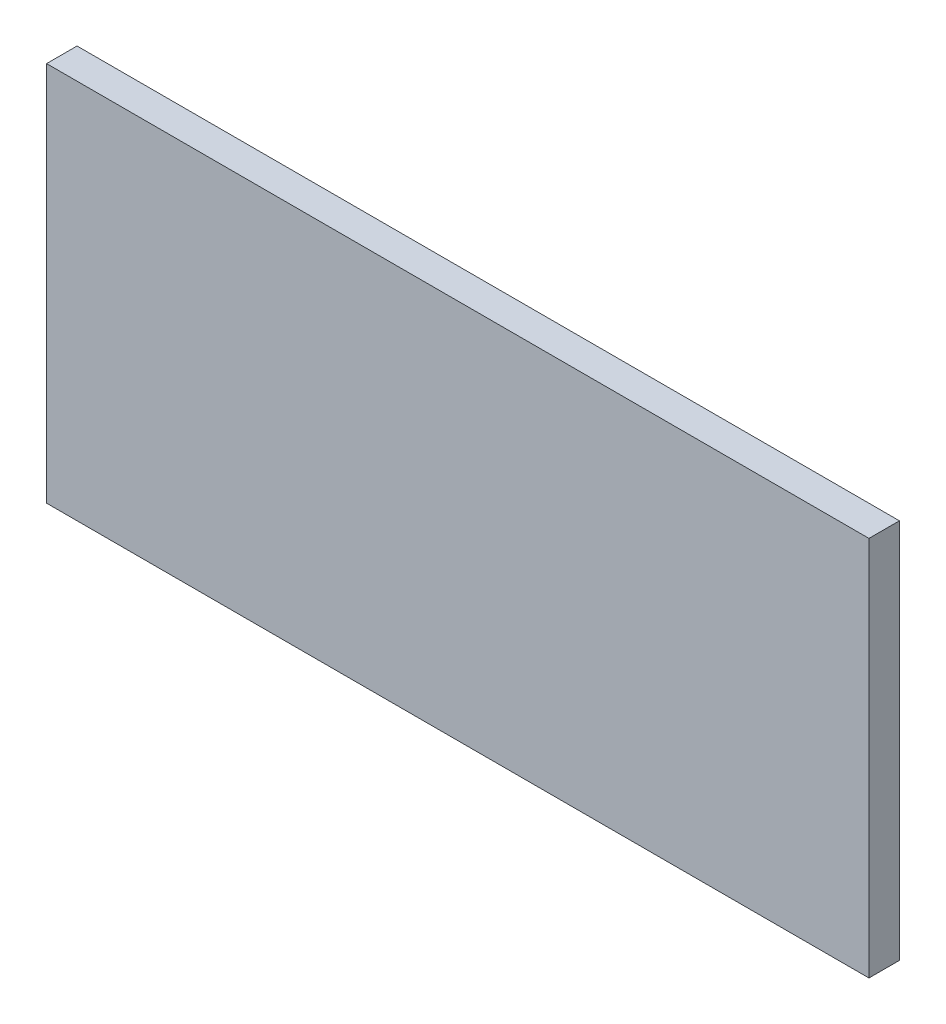
ISO-10303-21;
HEADER;
FILE_DESCRIPTION(('STEP AP214'),'2;1');
FILE_NAME('part.step','',(''),(''),'','','');
FILE_SCHEMA(('AUTOMOTIVE_DESIGN { 1 0 10303 214 1 1 1 1 }'));
ENDSEC;
DATA;
#1=APPLICATION_CONTEXT('core data for automotive mechanical design processes');
#2=APPLICATION_PROTOCOL_DEFINITION('international standard','automotive_design',2000,#1);
#3=PRODUCT_CONTEXT('',#1,'mechanical');
#4=PRODUCT('Part','Part','',(#3));
#5=PRODUCT_RELATED_PRODUCT_CATEGORY('part','',(#4));
#6=PRODUCT_DEFINITION_FORMATION('','',#4);
#7=PRODUCT_DEFINITION_CONTEXT('part definition',#1,'design');
#8=PRODUCT_DEFINITION('design','',#6,#7);
#9=PRODUCT_DEFINITION_SHAPE('','',#8);
#10=(LENGTH_UNIT() NAMED_UNIT(*) SI_UNIT(.MILLI.,.METRE.));
#11=(NAMED_UNIT(*) PLANE_ANGLE_UNIT() SI_UNIT($,.RADIAN.));
#12=(NAMED_UNIT(*) SI_UNIT($,.STERADIAN.) SOLID_ANGLE_UNIT());
#13=UNCERTAINTY_MEASURE_WITH_UNIT(LENGTH_MEASURE(1.E-05),#10,'distance_accuracy_value','');
#14=(GEOMETRIC_REPRESENTATION_CONTEXT(3) GLOBAL_UNCERTAINTY_ASSIGNED_CONTEXT((#13)) GLOBAL_UNIT_ASSIGNED_CONTEXT((#10,
#11,#12)) REPRESENTATION_CONTEXT('',''));
#15=CARTESIAN_POINT('',(0.,0.,0.));
#16=DIRECTION('',(0.,0.,1.));
#17=DIRECTION('',(1.,0.,0.));
#18=AXIS2_PLACEMENT_3D('',#15,#16,#17);
#19=CARTESIAN_POINT('',(270.,-125.,20.));
#20=DIRECTION('',(-1.,0.,0.));
#21=DIRECTION('',(0.,0.,1.));
#22=AXIS2_PLACEMENT_3D('',#19,#20,#21);
#23=PLANE('',#22);
#24=DIRECTION('',(0.,1.,0.));
#25=VECTOR('',#24,1.);
#26=CARTESIAN_POINT('',(270.,-125.,0.));
#27=LINE('',#26,#25);
#28=CARTESIAN_POINT('',(270.,-125.,0.));
#29=VERTEX_POINT('',#28);
#30=CARTESIAN_POINT('',(270.,125.,0.));
#31=VERTEX_POINT('',#30);
#32=EDGE_CURVE('E96',#29,#31,#27,.T.);
#33=ORIENTED_EDGE('',*,*,#32,.T.);
#34=DIRECTION('',(0.,0.,-1.));
#35=VECTOR('',#34,1.);
#36=CARTESIAN_POINT('',(270.,125.,20.));
#37=LINE('',#36,#35);
#38=CARTESIAN_POINT('',(270.,125.,20.));
#39=VERTEX_POINT('',#38);
#40=EDGE_CURVE('E11',#39,#31,#37,.T.);
#41=ORIENTED_EDGE('',*,*,#40,.F.);
#42=DIRECTION('',(0.,1.,0.));
#43=VECTOR('',#42,1.);
#44=CARTESIAN_POINT('',(270.,-125.,20.));
#45=LINE('',#44,#43);
#46=CARTESIAN_POINT('',(270.,-125.,20.));
#47=VERTEX_POINT('',#46);
#48=EDGE_CURVE('E84',#47,#39,#45,.T.);
#49=ORIENTED_EDGE('',*,*,#48,.F.);
#50=DIRECTION('',(0.,0.,-1.));
#51=VECTOR('',#50,1.);
#52=CARTESIAN_POINT('',(270.,-125.,20.));
#53=LINE('',#52,#51);
#54=EDGE_CURVE('E92',#47,#29,#53,.T.);
#55=ORIENTED_EDGE('',*,*,#54,.T.);
#56=EDGE_LOOP('',(#33,#41,#49,#55));
#57=FACE_BOUND('',#56,.T.);
#58=ADVANCED_FACE('F33',(#57),#23,.F.);
#59=CARTESIAN_POINT('',(-270.,125.,20.));
#60=DIRECTION('',(0.,-1.,0.));
#61=DIRECTION('',(0.,0.,-1.));
#62=AXIS2_PLACEMENT_3D('',#59,#60,#61);
#63=PLANE('',#62);
#64=DIRECTION('',(-1.,0.,0.));
#65=VECTOR('',#64,1.);
#66=CARTESIAN_POINT('',(-270.,125.,0.));
#67=LINE('',#66,#65);
#68=CARTESIAN_POINT('',(-270.,125.,0.));
#69=VERTEX_POINT('',#68);
#70=EDGE_CURVE('E88',#31,#69,#67,.T.);
#71=ORIENTED_EDGE('',*,*,#70,.T.);
#72=DIRECTION('',(0.,0.,-1.));
#73=VECTOR('',#72,1.);
#74=CARTESIAN_POINT('',(-270.,125.,20.));
#75=LINE('',#74,#73);
#76=CARTESIAN_POINT('',(-270.,125.,20.));
#77=VERTEX_POINT('',#76);
#78=EDGE_CURVE('E41',#77,#69,#75,.T.);
#79=ORIENTED_EDGE('',*,*,#78,.F.);
#80=DIRECTION('',(-1.,0.,0.));
#81=VECTOR('',#80,1.);
#82=CARTESIAN_POINT('',(-270.,125.,20.));
#83=LINE('',#82,#81);
#84=EDGE_CURVE('E79',#39,#77,#83,.T.);
#85=ORIENTED_EDGE('',*,*,#84,.F.);
#86=ORIENTED_EDGE('',*,*,#40,.T.);
#87=EDGE_LOOP('',(#71,#79,#85,#86));
#88=FACE_BOUND('',#87,.T.);
#89=ADVANCED_FACE('F87',(#88),#63,.F.);
#90=CARTESIAN_POINT('',(-270.,-125.,20.));
#91=DIRECTION('',(1.,0.,0.));
#92=DIRECTION('',(0.,0.,-1.));
#93=AXIS2_PLACEMENT_3D('',#90,#91,#92);
#94=PLANE('',#93);
#95=DIRECTION('',(0.,-1.,0.));
#96=VECTOR('',#95,1.);
#97=CARTESIAN_POINT('',(-270.,-125.,0.));
#98=LINE('',#97,#96);
#99=CARTESIAN_POINT('',(-270.,-125.,0.));
#100=VERTEX_POINT('',#99);
#101=EDGE_CURVE('E66',#69,#100,#98,.T.);
#102=ORIENTED_EDGE('',*,*,#101,.T.);
#103=DIRECTION('',(0.,0.,-1.));
#104=VECTOR('',#103,1.);
#105=CARTESIAN_POINT('',(-270.,-125.,20.));
#106=LINE('',#105,#104);
#107=CARTESIAN_POINT('',(-270.,-125.,20.));
#108=VERTEX_POINT('',#107);
#109=EDGE_CURVE('E89',#108,#100,#106,.T.);
#110=ORIENTED_EDGE('',*,*,#109,.F.);
#111=DIRECTION('',(0.,-1.,0.));
#112=VECTOR('',#111,1.);
#113=CARTESIAN_POINT('',(-270.,-125.,20.));
#114=LINE('',#113,#112);
#115=EDGE_CURVE('E82',#77,#108,#114,.T.);
#116=ORIENTED_EDGE('',*,*,#115,.F.);
#117=ORIENTED_EDGE('',*,*,#78,.T.);
#118=EDGE_LOOP('',(#102,#110,#116,#117));
#119=FACE_BOUND('',#118,.T.);
#120=ADVANCED_FACE('F90',(#119),#94,.F.);
#121=CARTESIAN_POINT('',(-270.,-125.,20.));
#122=DIRECTION('',(0.,1.,0.));
#123=DIRECTION('',(0.,0.,1.));
#124=AXIS2_PLACEMENT_3D('',#121,#122,#123);
#125=PLANE('',#124);
#126=DIRECTION('',(1.,0.,0.));
#127=VECTOR('',#126,1.);
#128=CARTESIAN_POINT('',(-270.,-125.,0.));
#129=LINE('',#128,#127);
#130=EDGE_CURVE('E72',#100,#29,#129,.T.);
#131=ORIENTED_EDGE('',*,*,#130,.T.);
#132=ORIENTED_EDGE('',*,*,#54,.F.);
#133=DIRECTION('',(1.,0.,0.));
#134=VECTOR('',#133,1.);
#135=CARTESIAN_POINT('',(-270.,-125.,20.));
#136=LINE('',#135,#134);
#137=EDGE_CURVE('E49',#108,#47,#136,.T.);
#138=ORIENTED_EDGE('',*,*,#137,.F.);
#139=ORIENTED_EDGE('',*,*,#109,.T.);
#140=EDGE_LOOP('',(#131,#132,#138,#139));
#141=FACE_BOUND('',#140,.T.);
#142=ADVANCED_FACE('F103',(#141),#125,.F.);
#143=CARTESIAN_POINT('',(0.,0.,20.));
#144=DIRECTION('',(0.,0.,-1.));
#145=DIRECTION('',(-1.,0.,0.));
#146=AXIS2_PLACEMENT_3D('',#143,#144,#145);
#147=PLANE('',#146);
#148=ORIENTED_EDGE('',*,*,#48,.T.);
#149=ORIENTED_EDGE('',*,*,#84,.T.);
#150=ORIENTED_EDGE('',*,*,#115,.T.);
#151=ORIENTED_EDGE('',*,*,#137,.T.);
#152=EDGE_LOOP('',(#148,#149,#150,#151));
#153=FACE_BOUND('',#152,.T.);
#154=ADVANCED_FACE('F80',(#153),#147,.F.);
#155=CARTESIAN_POINT('',(0.,0.,0.));
#156=DIRECTION('',(0.,0.,-1.));
#157=DIRECTION('',(-1.,0.,0.));
#158=AXIS2_PLACEMENT_3D('',#155,#156,#157);
#159=PLANE('',#158);
#160=ORIENTED_EDGE('',*,*,#32,.F.);
#161=ORIENTED_EDGE('',*,*,#130,.F.);
#162=ORIENTED_EDGE('',*,*,#101,.F.);
#163=ORIENTED_EDGE('',*,*,#70,.F.);
#164=EDGE_LOOP('',(#160,#161,#162,#163));
#165=FACE_BOUND('',#164,.T.);
#166=ADVANCED_FACE('F106',(#165),#159,.T.);
#167=CLOSED_SHELL('',(#58,#89,#120,#142,#154,#166));
#168=MANIFOLD_SOLID_BREP('B2',#167);
#169=ADVANCED_BREP_SHAPE_REPRESENTATION('',(#18,#168),#14);
#170=SHAPE_DEFINITION_REPRESENTATION(#9,#169);
ENDSEC;
END-ISO-10303-21;
